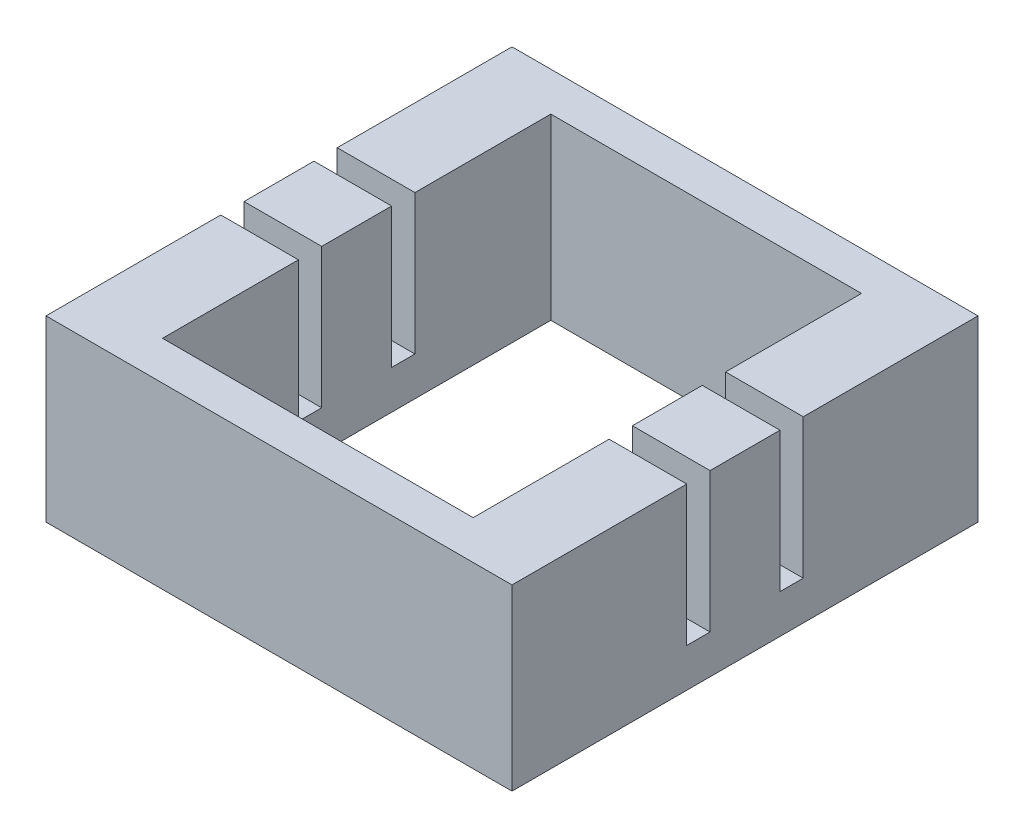
ISO-10303-21;
HEADER;
FILE_DESCRIPTION(('STEP AP214'),'2;1');
FILE_NAME('part.step','',(''),(''),'','','');
FILE_SCHEMA(('AUTOMOTIVE_DESIGN { 1 0 10303 214 1 1 1 1 }'));
ENDSEC;
DATA;
#1=APPLICATION_CONTEXT('core data for automotive mechanical design processes');
#2=APPLICATION_PROTOCOL_DEFINITION('international standard','automotive_design',2000,#1);
#3=PRODUCT_CONTEXT('',#1,'mechanical');
#4=PRODUCT('Part','Part','',(#3));
#5=PRODUCT_RELATED_PRODUCT_CATEGORY('part','',(#4));
#6=PRODUCT_DEFINITION_FORMATION('','',#4);
#7=PRODUCT_DEFINITION_CONTEXT('part definition',#1,'design');
#8=PRODUCT_DEFINITION('design','',#6,#7);
#9=PRODUCT_DEFINITION_SHAPE('','',#8);
#10=(LENGTH_UNIT() NAMED_UNIT(*) SI_UNIT(.MILLI.,.METRE.));
#11=(NAMED_UNIT(*) PLANE_ANGLE_UNIT() SI_UNIT($,.RADIAN.));
#12=(NAMED_UNIT(*) SI_UNIT($,.STERADIAN.) SOLID_ANGLE_UNIT());
#13=UNCERTAINTY_MEASURE_WITH_UNIT(LENGTH_MEASURE(1.E-05),#10,'distance_accuracy_value','');
#14=(GEOMETRIC_REPRESENTATION_CONTEXT(3) GLOBAL_UNCERTAINTY_ASSIGNED_CONTEXT((#13)) GLOBAL_UNIT_ASSIGNED_CONTEXT((#10,
#11,#12)) REPRESENTATION_CONTEXT('',''));
#15=CARTESIAN_POINT('',(0.,0.,0.));
#16=DIRECTION('',(0.,0.,1.));
#17=DIRECTION('',(1.,0.,0.));
#18=AXIS2_PLACEMENT_3D('',#15,#16,#17);
#19=CARTESIAN_POINT('',(0.,23.,0.));
#20=DIRECTION('',(0.,-1.,0.));
#21=DIRECTION('',(0.,0.,-1.));
#22=AXIS2_PLACEMENT_3D('',#19,#20,#21);
#23=PLANE('',#22);
#24=DIRECTION('',(0.,0.,1.));
#25=VECTOR('',#24,1.);
#26=CARTESIAN_POINT('',(0.,23.,0.));
#27=LINE('',#26,#25);
#28=CARTESIAN_POINT('',(0.,23.,-60.));
#29=VERTEX_POINT('',#28);
#30=CARTESIAN_POINT('',(0.,23.,-37.5));
#31=VERTEX_POINT('',#30);
#32=EDGE_CURVE('E324',#29,#31,#27,.T.);
#33=ORIENTED_EDGE('',*,*,#32,.T.);
#34=DIRECTION('',(-1.,0.,0.));
#35=VECTOR('',#34,1.);
#36=CARTESIAN_POINT('',(60.,23.,-37.5));
#37=LINE('',#36,#35);
#38=CARTESIAN_POINT('',(10.,23.,-37.5));
#39=VERTEX_POINT('',#38);
#40=EDGE_CURVE('E241',#39,#31,#37,.T.);
#41=ORIENTED_EDGE('',*,*,#40,.F.);
#42=DIRECTION('',(0.,0.,1.));
#43=VECTOR('',#42,1.);
#44=CARTESIAN_POINT('',(10.,23.,-5.));
#45=LINE('',#44,#43);
#46=CARTESIAN_POINT('',(10.,23.,-55.));
#47=VERTEX_POINT('',#46);
#48=EDGE_CURVE('E288',#47,#39,#45,.T.);
#49=ORIENTED_EDGE('',*,*,#48,.F.);
#50=DIRECTION('',(-1.,0.,0.));
#51=VECTOR('',#50,1.);
#52=CARTESIAN_POINT('',(10.,23.,-55.));
#53=LINE('',#52,#51);
#54=CARTESIAN_POINT('',(50.,23.,-55.));
#55=VERTEX_POINT('',#54);
#56=EDGE_CURVE('E299',#55,#47,#53,.T.);
#57=ORIENTED_EDGE('',*,*,#56,.F.);
#58=DIRECTION('',(0.,0.,-1.));
#59=VECTOR('',#58,1.);
#60=CARTESIAN_POINT('',(50.,23.,-5.));
#61=LINE('',#60,#59);
#62=CARTESIAN_POINT('',(50.,23.,-37.5));
#63=VERTEX_POINT('',#62);
#64=EDGE_CURVE('E295',#63,#55,#61,.T.);
#65=ORIENTED_EDGE('',*,*,#64,.F.);
#66=CARTESIAN_POINT('',(60.,23.,-37.5));
#67=VERTEX_POINT('',#66);
#68=EDGE_CURVE('E238',#67,#63,#37,.T.);
#69=ORIENTED_EDGE('',*,*,#68,.F.);
#70=DIRECTION('',(0.,0.,-1.));
#71=VECTOR('',#70,1.);
#72=CARTESIAN_POINT('',(60.,23.,0.));
#73=LINE('',#72,#71);
#74=CARTESIAN_POINT('',(60.,23.,-60.));
#75=VERTEX_POINT('',#74);
#76=EDGE_CURVE('E226',#67,#75,#73,.T.);
#77=ORIENTED_EDGE('',*,*,#76,.T.);
#78=DIRECTION('',(-1.,0.,0.));
#79=VECTOR('',#78,1.);
#80=CARTESIAN_POINT('',(0.,23.,-60.));
#81=LINE('',#80,#79);
#82=EDGE_CURVE('E334',#75,#29,#81,.T.);
#83=ORIENTED_EDGE('',*,*,#82,.T.);
#84=EDGE_LOOP('',(#33,#41,#49,#57,#65,#69,#77,#83));
#85=FACE_BOUND('',#84,.T.);
#86=ADVANCED_FACE('F43',(#85),#23,.F.);
#87=CARTESIAN_POINT('',(60.,23.,-25.5));
#88=VERTEX_POINT('',#87);
#89=CARTESIAN_POINT('',(60.,23.,-34.5));
#90=VERTEX_POINT('',#89);
#91=EDGE_CURVE('E335',#88,#90,#73,.T.);
#92=ORIENTED_EDGE('',*,*,#91,.T.);
#93=DIRECTION('',(-1.,0.,0.));
#94=VECTOR('',#93,1.);
#95=CARTESIAN_POINT('',(60.,23.,-34.5));
#96=LINE('',#95,#94);
#97=CARTESIAN_POINT('',(50.,23.,-34.5));
#98=VERTEX_POINT('',#97);
#99=EDGE_CURVE('E242',#90,#98,#96,.T.);
#100=ORIENTED_EDGE('',*,*,#99,.T.);
#101=CARTESIAN_POINT('',(50.,23.,-25.5));
#102=VERTEX_POINT('',#101);
#103=EDGE_CURVE('E300',#102,#98,#61,.T.);
#104=ORIENTED_EDGE('',*,*,#103,.F.);
#105=DIRECTION('',(-1.,0.,0.));
#106=VECTOR('',#105,1.);
#107=CARTESIAN_POINT('',(60.,23.,-25.5));
#108=LINE('',#107,#106);
#109=EDGE_CURVE('E252',#88,#102,#108,.T.);
#110=ORIENTED_EDGE('',*,*,#109,.F.);
#111=EDGE_LOOP('',(#92,#100,#104,#110));
#112=FACE_BOUND('',#111,.T.);
#113=ADVANCED_FACE('F372',(#112),#23,.F.);
#114=CARTESIAN_POINT('',(60.,23.,0.));
#115=VERTEX_POINT('',#114);
#116=CARTESIAN_POINT('',(60.,23.,-22.5));
#117=VERTEX_POINT('',#116);
#118=EDGE_CURVE('E331',#115,#117,#73,.T.);
#119=ORIENTED_EDGE('',*,*,#118,.T.);
#120=DIRECTION('',(-1.,0.,0.));
#121=VECTOR('',#120,1.);
#122=CARTESIAN_POINT('',(60.,23.,-22.5));
#123=LINE('',#122,#121);
#124=CARTESIAN_POINT('',(50.,23.,-22.5));
#125=VERTEX_POINT('',#124);
#126=EDGE_CURVE('E247',#117,#125,#123,.T.);
#127=ORIENTED_EDGE('',*,*,#126,.T.);
#128=CARTESIAN_POINT('',(50.,23.,-5.));
#129=VERTEX_POINT('',#128);
#130=EDGE_CURVE('E296',#129,#125,#61,.T.);
#131=ORIENTED_EDGE('',*,*,#130,.F.);
#132=DIRECTION('',(1.,0.,0.));
#133=VECTOR('',#132,1.);
#134=CARTESIAN_POINT('',(10.,23.,-5.));
#135=LINE('',#134,#133);
#136=CARTESIAN_POINT('',(10.,23.,-5.));
#137=VERTEX_POINT('',#136);
#138=EDGE_CURVE('E291',#137,#129,#135,.T.);
#139=ORIENTED_EDGE('',*,*,#138,.F.);
#140=CARTESIAN_POINT('',(10.,23.,-22.5));
#141=VERTEX_POINT('',#140);
#142=EDGE_CURVE('E293',#141,#137,#45,.T.);
#143=ORIENTED_EDGE('',*,*,#142,.F.);
#144=CARTESIAN_POINT('',(0.,23.,-22.5));
#145=VERTEX_POINT('',#144);
#146=EDGE_CURVE('E251',#141,#145,#123,.T.);
#147=ORIENTED_EDGE('',*,*,#146,.T.);
#148=CARTESIAN_POINT('',(0.,23.,0.));
#149=VERTEX_POINT('',#148);
#150=EDGE_CURVE('E329',#145,#149,#27,.T.);
#151=ORIENTED_EDGE('',*,*,#150,.T.);
#152=DIRECTION('',(1.,0.,0.));
#153=VECTOR('',#152,1.);
#154=CARTESIAN_POINT('',(0.,23.,0.));
#155=LINE('',#154,#153);
#156=EDGE_CURVE('E327',#149,#115,#155,.T.);
#157=ORIENTED_EDGE('',*,*,#156,.T.);
#158=EDGE_LOOP('',(#119,#127,#131,#139,#143,#147,#151,#157));
#159=FACE_BOUND('',#158,.T.);
#160=ADVANCED_FACE('F401',(#159),#23,.F.);
#161=CARTESIAN_POINT('',(10.,23.,-34.5));
#162=VERTEX_POINT('',#161);
#163=CARTESIAN_POINT('',(10.,23.,-25.5));
#164=VERTEX_POINT('',#163);
#165=EDGE_CURVE('E292',#162,#164,#45,.T.);
#166=ORIENTED_EDGE('',*,*,#165,.F.);
#167=CARTESIAN_POINT('',(0.,23.,-34.5));
#168=VERTEX_POINT('',#167);
#169=EDGE_CURVE('E245',#162,#168,#96,.T.);
#170=ORIENTED_EDGE('',*,*,#169,.T.);
#171=CARTESIAN_POINT('',(0.,23.,-25.5));
#172=VERTEX_POINT('',#171);
#173=EDGE_CURVE('E328',#168,#172,#27,.T.);
#174=ORIENTED_EDGE('',*,*,#173,.T.);
#175=EDGE_CURVE('E254',#164,#172,#108,.T.);
#176=ORIENTED_EDGE('',*,*,#175,.F.);
#177=EDGE_LOOP('',(#166,#170,#174,#176));
#178=FACE_BOUND('',#177,.T.);
#179=ADVANCED_FACE('F436',(#178),#23,.F.);
#180=CARTESIAN_POINT('',(0.,0.,0.));
#181=DIRECTION('',(0.,-1.,0.));
#182=DIRECTION('',(0.,0.,-1.));
#183=AXIS2_PLACEMENT_3D('',#180,#181,#182);
#184=PLANE('',#183);
#185=DIRECTION('',(0.,0.,1.));
#186=VECTOR('',#185,1.);
#187=CARTESIAN_POINT('',(0.,0.,0.));
#188=LINE('',#187,#186);
#189=CARTESIAN_POINT('',(0.,0.,-60.));
#190=VERTEX_POINT('',#189);
#191=CARTESIAN_POINT('',(0.,0.,0.));
#192=VERTEX_POINT('',#191);
#193=EDGE_CURVE('E323',#190,#192,#188,.T.);
#194=ORIENTED_EDGE('',*,*,#193,.F.);
#195=DIRECTION('',(-1.,0.,0.));
#196=VECTOR('',#195,1.);
#197=CARTESIAN_POINT('',(0.,0.,-60.));
#198=LINE('',#197,#196);
#199=CARTESIAN_POINT('',(60.,0.,-60.));
#200=VERTEX_POINT('',#199);
#201=EDGE_CURVE('E344',#200,#190,#198,.T.);
#202=ORIENTED_EDGE('',*,*,#201,.F.);
#203=DIRECTION('',(0.,0.,-1.));
#204=VECTOR('',#203,1.);
#205=CARTESIAN_POINT('',(60.,0.,0.));
#206=LINE('',#205,#204);
#207=CARTESIAN_POINT('',(60.,0.,0.));
#208=VERTEX_POINT('',#207);
#209=EDGE_CURVE('E342',#208,#200,#206,.T.);
#210=ORIENTED_EDGE('',*,*,#209,.F.);
#211=DIRECTION('',(1.,0.,0.));
#212=VECTOR('',#211,1.);
#213=CARTESIAN_POINT('',(0.,0.,0.));
#214=LINE('',#213,#212);
#215=EDGE_CURVE('E340',#192,#208,#214,.T.);
#216=ORIENTED_EDGE('',*,*,#215,.F.);
#217=EDGE_LOOP('',(#194,#202,#210,#216));
#218=FACE_BOUND('',#217,.T.);
#219=DIRECTION('',(-1.,0.,0.));
#220=VECTOR('',#219,1.);
#221=CARTESIAN_POINT('',(10.,0.,-55.));
#222=LINE('',#221,#220);
#223=CARTESIAN_POINT('',(50.,0.,-55.));
#224=VERTEX_POINT('',#223);
#225=CARTESIAN_POINT('',(10.,0.,-55.));
#226=VERTEX_POINT('',#225);
#227=EDGE_CURVE('E311',#224,#226,#222,.T.);
#228=ORIENTED_EDGE('',*,*,#227,.T.);
#229=DIRECTION('',(0.,0.,1.));
#230=VECTOR('',#229,1.);
#231=CARTESIAN_POINT('',(10.,0.,-5.));
#232=LINE('',#231,#230);
#233=CARTESIAN_POINT('',(10.,0.,-5.));
#234=VERTEX_POINT('',#233);
#235=EDGE_CURVE('E287',#226,#234,#232,.T.);
#236=ORIENTED_EDGE('',*,*,#235,.T.);
#237=DIRECTION('',(1.,0.,0.));
#238=VECTOR('',#237,1.);
#239=CARTESIAN_POINT('',(10.,0.,-5.));
#240=LINE('',#239,#238);
#241=CARTESIAN_POINT('',(50.,0.,-5.));
#242=VERTEX_POINT('',#241);
#243=EDGE_CURVE('E305',#234,#242,#240,.T.);
#244=ORIENTED_EDGE('',*,*,#243,.T.);
#245=DIRECTION('',(0.,0.,-1.));
#246=VECTOR('',#245,1.);
#247=CARTESIAN_POINT('',(50.,0.,-5.));
#248=LINE('',#247,#246);
#249=EDGE_CURVE('E308',#242,#224,#248,.T.);
#250=ORIENTED_EDGE('',*,*,#249,.T.);
#251=EDGE_LOOP('',(#228,#236,#244,#250));
#252=FACE_BOUND('',#251,.T.);
#253=ADVANCED_FACE('F394',(#218,#252),#184,.T.);
#254=CARTESIAN_POINT('',(0.,23.,0.));
#255=DIRECTION('',(1.,0.,0.));
#256=DIRECTION('',(0.,0.,-1.));
#257=AXIS2_PLACEMENT_3D('',#254,#255,#256);
#258=PLANE('',#257);
#259=DIRECTION('',(0.,0.,1.));
#260=VECTOR('',#259,1.);
#261=CARTESIAN_POINT('',(0.,5.,-37.5));
#262=LINE('',#261,#260);
#263=CARTESIAN_POINT('',(0.,5.,-37.5));
#264=VERTEX_POINT('',#263);
#265=CARTESIAN_POINT('',(0.,5.,-34.5));
#266=VERTEX_POINT('',#265);
#267=EDGE_CURVE('E229',#264,#266,#262,.T.);
#268=ORIENTED_EDGE('',*,*,#267,.F.);
#269=DIRECTION('',(0.,-1.,0.));
#270=VECTOR('',#269,1.);
#271=CARTESIAN_POINT('',(0.,23.,-37.5));
#272=LINE('',#271,#270);
#273=EDGE_CURVE('E233',#31,#264,#272,.T.);
#274=ORIENTED_EDGE('',*,*,#273,.F.);
#275=ORIENTED_EDGE('',*,*,#32,.F.);
#276=DIRECTION('',(0.,-1.,0.));
#277=VECTOR('',#276,1.);
#278=CARTESIAN_POINT('',(0.,23.,-60.));
#279=LINE('',#278,#277);
#280=EDGE_CURVE('E337',#29,#190,#279,.T.);
#281=ORIENTED_EDGE('',*,*,#280,.T.);
#282=ORIENTED_EDGE('',*,*,#193,.T.);
#283=DIRECTION('',(0.,-1.,0.));
#284=VECTOR('',#283,1.);
#285=CARTESIAN_POINT('',(0.,23.,0.));
#286=LINE('',#285,#284);
#287=EDGE_CURVE('E354',#149,#192,#286,.T.);
#288=ORIENTED_EDGE('',*,*,#287,.F.);
#289=ORIENTED_EDGE('',*,*,#150,.F.);
#290=DIRECTION('',(0.,1.,0.));
#291=VECTOR('',#290,1.);
#292=CARTESIAN_POINT('',(0.,23.,-22.5));
#293=LINE('',#292,#291);
#294=CARTESIAN_POINT('',(0.,5.,-22.5));
#295=VERTEX_POINT('',#294);
#296=EDGE_CURVE('E236',#295,#145,#293,.T.);
#297=ORIENTED_EDGE('',*,*,#296,.F.);
#298=DIRECTION('',(0.,0.,1.));
#299=VECTOR('',#298,1.);
#300=CARTESIAN_POINT('',(0.,5.,-22.5));
#301=LINE('',#300,#299);
#302=CARTESIAN_POINT('',(0.,5.,-25.5));
#303=VERTEX_POINT('',#302);
#304=EDGE_CURVE('E262',#303,#295,#301,.T.);
#305=ORIENTED_EDGE('',*,*,#304,.F.);
#306=DIRECTION('',(0.,-1.,0.));
#307=VECTOR('',#306,1.);
#308=CARTESIAN_POINT('',(0.,23.,-25.5));
#309=LINE('',#308,#307);
#310=EDGE_CURVE('E265',#172,#303,#309,.T.);
#311=ORIENTED_EDGE('',*,*,#310,.F.);
#312=ORIENTED_EDGE('',*,*,#173,.F.);
#313=DIRECTION('',(0.,1.,0.));
#314=VECTOR('',#313,1.);
#315=CARTESIAN_POINT('',(0.,23.,-34.5));
#316=LINE('',#315,#314);
#317=EDGE_CURVE('E227',#266,#168,#316,.T.);
#318=ORIENTED_EDGE('',*,*,#317,.F.);
#319=EDGE_LOOP('',(#268,#274,#275,#281,#282,#288,#289,#297,#305,#311,#312,#318));
#320=FACE_BOUND('',#319,.T.);
#321=ADVANCED_FACE('F45',(#320),#258,.F.);
#322=CARTESIAN_POINT('',(0.,23.,0.));
#323=DIRECTION('',(0.,0.,-1.));
#324=DIRECTION('',(-1.,0.,0.));
#325=AXIS2_PLACEMENT_3D('',#322,#323,#324);
#326=PLANE('',#325);
#327=ORIENTED_EDGE('',*,*,#215,.T.);
#328=DIRECTION('',(0.,-1.,0.));
#329=VECTOR('',#328,1.);
#330=CARTESIAN_POINT('',(60.,23.,0.));
#331=LINE('',#330,#329);
#332=EDGE_CURVE('E351',#115,#208,#331,.T.);
#333=ORIENTED_EDGE('',*,*,#332,.F.);
#334=ORIENTED_EDGE('',*,*,#156,.F.);
#335=ORIENTED_EDGE('',*,*,#287,.T.);
#336=EDGE_LOOP('',(#327,#333,#334,#335));
#337=FACE_BOUND('',#336,.T.);
#338=ADVANCED_FACE('F593',(#337),#326,.F.);
#339=CARTESIAN_POINT('',(60.,23.,0.));
#340=DIRECTION('',(-1.,0.,0.));
#341=DIRECTION('',(0.,0.,1.));
#342=AXIS2_PLACEMENT_3D('',#339,#340,#341);
#343=PLANE('',#342);
#344=ORIENTED_EDGE('',*,*,#76,.F.);
#345=DIRECTION('',(0.,-1.,0.));
#346=VECTOR('',#345,1.);
#347=CARTESIAN_POINT('',(60.,23.,-37.5));
#348=LINE('',#347,#346);
#349=CARTESIAN_POINT('',(60.,5.,-37.5));
#350=VERTEX_POINT('',#349);
#351=EDGE_CURVE('E206',#67,#350,#348,.T.);
#352=ORIENTED_EDGE('',*,*,#351,.T.);
#353=DIRECTION('',(0.,0.,1.));
#354=VECTOR('',#353,1.);
#355=CARTESIAN_POINT('',(60.,5.,-37.5));
#356=LINE('',#355,#354);
#357=CARTESIAN_POINT('',(60.,5.,-34.5));
#358=VERTEX_POINT('',#357);
#359=EDGE_CURVE('E214',#350,#358,#356,.T.);
#360=ORIENTED_EDGE('',*,*,#359,.T.);
#361=DIRECTION('',(0.,1.,0.));
#362=VECTOR('',#361,1.);
#363=CARTESIAN_POINT('',(60.,23.,-34.5));
#364=LINE('',#363,#362);
#365=EDGE_CURVE('E221',#358,#90,#364,.T.);
#366=ORIENTED_EDGE('',*,*,#365,.T.);
#367=ORIENTED_EDGE('',*,*,#91,.F.);
#368=DIRECTION('',(0.,-1.,0.));
#369=VECTOR('',#368,1.);
#370=CARTESIAN_POINT('',(60.,23.,-25.5));
#371=LINE('',#370,#369);
#372=CARTESIAN_POINT('',(60.,5.,-25.5));
#373=VERTEX_POINT('',#372);
#374=EDGE_CURVE('E271',#88,#373,#371,.T.);
#375=ORIENTED_EDGE('',*,*,#374,.T.);
#376=DIRECTION('',(0.,0.,1.));
#377=VECTOR('',#376,1.);
#378=CARTESIAN_POINT('',(60.,5.,-22.5));
#379=LINE('',#378,#377);
#380=CARTESIAN_POINT('',(60.,5.,-22.5));
#381=VERTEX_POINT('',#380);
#382=EDGE_CURVE('E250',#373,#381,#379,.T.);
#383=ORIENTED_EDGE('',*,*,#382,.T.);
#384=DIRECTION('',(0.,1.,0.));
#385=VECTOR('',#384,1.);
#386=CARTESIAN_POINT('',(60.,23.,-22.5));
#387=LINE('',#386,#385);
#388=EDGE_CURVE('E266',#381,#117,#387,.T.);
#389=ORIENTED_EDGE('',*,*,#388,.T.);
#390=ORIENTED_EDGE('',*,*,#118,.F.);
#391=ORIENTED_EDGE('',*,*,#332,.T.);
#392=ORIENTED_EDGE('',*,*,#209,.T.);
#393=DIRECTION('',(0.,-1.,0.));
#394=VECTOR('',#393,1.);
#395=CARTESIAN_POINT('',(60.,23.,-60.));
#396=LINE('',#395,#394);
#397=EDGE_CURVE('E348',#75,#200,#396,.T.);
#398=ORIENTED_EDGE('',*,*,#397,.F.);
#399=EDGE_LOOP('',(#344,#352,#360,#366,#367,#375,#383,#389,#390,#391,#392,#398));
#400=FACE_BOUND('',#399,.T.);
#401=ADVANCED_FACE('F224',(#400),#343,.F.);
#402=CARTESIAN_POINT('',(0.,23.,-60.));
#403=DIRECTION('',(0.,0.,1.));
#404=DIRECTION('',(1.,0.,0.));
#405=AXIS2_PLACEMENT_3D('',#402,#403,#404);
#406=PLANE('',#405);
#407=ORIENTED_EDGE('',*,*,#201,.T.);
#408=ORIENTED_EDGE('',*,*,#280,.F.);
#409=ORIENTED_EDGE('',*,*,#82,.F.);
#410=ORIENTED_EDGE('',*,*,#397,.T.);
#411=EDGE_LOOP('',(#407,#408,#409,#410));
#412=FACE_BOUND('',#411,.T.);
#413=ADVANCED_FACE('F417',(#412),#406,.F.);
#414=CARTESIAN_POINT('',(10.,23.,-5.));
#415=DIRECTION('',(1.,0.,0.));
#416=DIRECTION('',(0.,0.,-1.));
#417=AXIS2_PLACEMENT_3D('',#414,#415,#416);
#418=PLANE('',#417);
#419=DIRECTION('',(0.,1.,0.));
#420=VECTOR('',#419,1.);
#421=CARTESIAN_POINT('',(10.,23.,-37.5));
#422=LINE('',#421,#420);
#423=CARTESIAN_POINT('',(10.,5.,-37.5));
#424=VERTEX_POINT('',#423);
#425=EDGE_CURVE('E285',#424,#39,#422,.T.);
#426=ORIENTED_EDGE('',*,*,#425,.F.);
#427=DIRECTION('',(0.,0.,-1.));
#428=VECTOR('',#427,1.);
#429=CARTESIAN_POINT('',(10.,5.,-5.));
#430=LINE('',#429,#428);
#431=CARTESIAN_POINT('',(10.,5.,-34.5));
#432=VERTEX_POINT('',#431);
#433=EDGE_CURVE('E281',#432,#424,#430,.T.);
#434=ORIENTED_EDGE('',*,*,#433,.F.);
#435=DIRECTION('',(0.,-1.,0.));
#436=VECTOR('',#435,1.);
#437=CARTESIAN_POINT('',(10.,23.,-34.5));
#438=LINE('',#437,#436);
#439=EDGE_CURVE('E283',#162,#432,#438,.T.);
#440=ORIENTED_EDGE('',*,*,#439,.F.);
#441=ORIENTED_EDGE('',*,*,#165,.T.);
#442=DIRECTION('',(0.,1.,0.));
#443=VECTOR('',#442,1.);
#444=CARTESIAN_POINT('',(10.,23.,-25.5));
#445=LINE('',#444,#443);
#446=CARTESIAN_POINT('',(10.,5.,-25.5));
#447=VERTEX_POINT('',#446);
#448=EDGE_CURVE('E240',#447,#164,#445,.T.);
#449=ORIENTED_EDGE('',*,*,#448,.F.);
#450=DIRECTION('',(0.,0.,-1.));
#451=VECTOR('',#450,1.);
#452=CARTESIAN_POINT('',(10.,5.,-5.));
#453=LINE('',#452,#451);
#454=CARTESIAN_POINT('',(10.,5.,-22.5));
#455=VERTEX_POINT('',#454);
#456=EDGE_CURVE('E277',#455,#447,#453,.T.);
#457=ORIENTED_EDGE('',*,*,#456,.F.);
#458=DIRECTION('',(0.,-1.,0.));
#459=VECTOR('',#458,1.);
#460=CARTESIAN_POINT('',(10.,23.,-22.5));
#461=LINE('',#460,#459);
#462=EDGE_CURVE('E279',#141,#455,#461,.T.);
#463=ORIENTED_EDGE('',*,*,#462,.F.);
#464=ORIENTED_EDGE('',*,*,#142,.T.);
#465=DIRECTION('',(0.,-1.,0.));
#466=VECTOR('',#465,1.);
#467=CARTESIAN_POINT('',(10.,23.,-5.));
#468=LINE('',#467,#466);
#469=EDGE_CURVE('E320',#137,#234,#468,.T.);
#470=ORIENTED_EDGE('',*,*,#469,.T.);
#471=ORIENTED_EDGE('',*,*,#235,.F.);
#472=DIRECTION('',(0.,-1.,0.));
#473=VECTOR('',#472,1.);
#474=CARTESIAN_POINT('',(10.,23.,-55.));
#475=LINE('',#474,#473);
#476=EDGE_CURVE('E302',#47,#226,#475,.T.);
#477=ORIENTED_EDGE('',*,*,#476,.F.);
#478=ORIENTED_EDGE('',*,*,#48,.T.);
#479=EDGE_LOOP('',(#426,#434,#440,#441,#449,#457,#463,#464,#470,#471,#477,#478));
#480=FACE_BOUND('',#479,.T.);
#481=ADVANCED_FACE('F391',(#480),#418,.T.);
#482=CARTESIAN_POINT('',(10.,23.,-5.));
#483=DIRECTION('',(0.,0.,-1.));
#484=DIRECTION('',(-1.,0.,0.));
#485=AXIS2_PLACEMENT_3D('',#482,#483,#484);
#486=PLANE('',#485);
#487=ORIENTED_EDGE('',*,*,#243,.F.);
#488=ORIENTED_EDGE('',*,*,#469,.F.);
#489=ORIENTED_EDGE('',*,*,#138,.T.);
#490=DIRECTION('',(0.,-1.,0.));
#491=VECTOR('',#490,1.);
#492=CARTESIAN_POINT('',(50.,23.,-5.));
#493=LINE('',#492,#491);
#494=EDGE_CURVE('E318',#129,#242,#493,.T.);
#495=ORIENTED_EDGE('',*,*,#494,.T.);
#496=EDGE_LOOP('',(#487,#488,#489,#495));
#497=FACE_BOUND('',#496,.T.);
#498=ADVANCED_FACE('F443',(#497),#486,.T.);
#499=CARTESIAN_POINT('',(50.,23.,-5.));
#500=DIRECTION('',(-1.,0.,0.));
#501=DIRECTION('',(0.,0.,1.));
#502=AXIS2_PLACEMENT_3D('',#499,#500,#501);
#503=PLANE('',#502);
#504=DIRECTION('',(0.,-1.,0.));
#505=VECTOR('',#504,1.);
#506=CARTESIAN_POINT('',(50.,23.,-37.5));
#507=LINE('',#506,#505);
#508=CARTESIAN_POINT('',(50.,5.,-37.5));
#509=VERTEX_POINT('',#508);
#510=EDGE_CURVE('E11',#63,#509,#507,.T.);
#511=ORIENTED_EDGE('',*,*,#510,.F.);
#512=ORIENTED_EDGE('',*,*,#64,.T.);
#513=DIRECTION('',(0.,-1.,0.));
#514=VECTOR('',#513,1.);
#515=CARTESIAN_POINT('',(50.,23.,-55.));
#516=LINE('',#515,#514);
#517=EDGE_CURVE('E316',#55,#224,#516,.T.);
#518=ORIENTED_EDGE('',*,*,#517,.T.);
#519=ORIENTED_EDGE('',*,*,#249,.F.);
#520=ORIENTED_EDGE('',*,*,#494,.F.);
#521=ORIENTED_EDGE('',*,*,#130,.T.);
#522=DIRECTION('',(0.,1.,0.));
#523=VECTOR('',#522,1.);
#524=CARTESIAN_POINT('',(50.,23.,-22.5));
#525=LINE('',#524,#523);
#526=CARTESIAN_POINT('',(50.,5.,-22.5));
#527=VERTEX_POINT('',#526);
#528=EDGE_CURVE('E361',#527,#125,#525,.T.);
#529=ORIENTED_EDGE('',*,*,#528,.F.);
#530=DIRECTION('',(0.,0.,1.));
#531=VECTOR('',#530,1.);
#532=CARTESIAN_POINT('',(50.,5.,-5.));
#533=LINE('',#532,#531);
#534=CARTESIAN_POINT('',(50.,5.,-25.5));
#535=VERTEX_POINT('',#534);
#536=EDGE_CURVE('E359',#535,#527,#533,.T.);
#537=ORIENTED_EDGE('',*,*,#536,.F.);
#538=DIRECTION('',(0.,-1.,0.));
#539=VECTOR('',#538,1.);
#540=CARTESIAN_POINT('',(50.,23.,-25.5));
#541=LINE('',#540,#539);
#542=EDGE_CURVE('E357',#102,#535,#541,.T.);
#543=ORIENTED_EDGE('',*,*,#542,.F.);
#544=ORIENTED_EDGE('',*,*,#103,.T.);
#545=DIRECTION('',(0.,1.,0.));
#546=VECTOR('',#545,1.);
#547=CARTESIAN_POINT('',(50.,23.,-34.5));
#548=LINE('',#547,#546);
#549=CARTESIAN_POINT('',(50.,5.,-34.5));
#550=VERTEX_POINT('',#549);
#551=EDGE_CURVE('E51',#550,#98,#548,.T.);
#552=ORIENTED_EDGE('',*,*,#551,.F.);
#553=DIRECTION('',(0.,0.,1.));
#554=VECTOR('',#553,1.);
#555=CARTESIAN_POINT('',(50.,5.,-5.));
#556=LINE('',#555,#554);
#557=EDGE_CURVE('E363',#509,#550,#556,.T.);
#558=ORIENTED_EDGE('',*,*,#557,.F.);
#559=EDGE_LOOP('',(#511,#512,#518,#519,#520,#521,#529,#537,#543,#544,#552,#558));
#560=FACE_BOUND('',#559,.T.);
#561=ADVANCED_FACE('F376',(#560),#503,.T.);
#562=CARTESIAN_POINT('',(10.,23.,-55.));
#563=DIRECTION('',(0.,0.,1.));
#564=DIRECTION('',(1.,0.,0.));
#565=AXIS2_PLACEMENT_3D('',#562,#563,#564);
#566=PLANE('',#565);
#567=ORIENTED_EDGE('',*,*,#227,.F.);
#568=ORIENTED_EDGE('',*,*,#517,.F.);
#569=ORIENTED_EDGE('',*,*,#56,.T.);
#570=ORIENTED_EDGE('',*,*,#476,.T.);
#571=EDGE_LOOP('',(#567,#568,#569,#570));
#572=FACE_BOUND('',#571,.T.);
#573=ADVANCED_FACE('F385',(#572),#566,.T.);
#574=CARTESIAN_POINT('',(60.,23.,-25.5));
#575=DIRECTION('',(0.,0.,-1.));
#576=DIRECTION('',(0.,1.,0.));
#577=AXIS2_PLACEMENT_3D('',#574,#575,#576);
#578=PLANE('',#577);
#579=ORIENTED_EDGE('',*,*,#542,.T.);
#580=DIRECTION('',(-1.,0.,0.));
#581=VECTOR('',#580,1.);
#582=CARTESIAN_POINT('',(60.,5.,-25.5));
#583=LINE('',#582,#581);
#584=EDGE_CURVE('E255',#373,#535,#583,.T.);
#585=ORIENTED_EDGE('',*,*,#584,.F.);
#586=ORIENTED_EDGE('',*,*,#374,.F.);
#587=ORIENTED_EDGE('',*,*,#109,.T.);
#588=EDGE_LOOP('',(#579,#585,#586,#587));
#589=FACE_BOUND('',#588,.T.);
#590=ADVANCED_FACE('F411',(#589),#578,.F.);
#591=CARTESIAN_POINT('',(60.,5.,-22.5));
#592=DIRECTION('',(0.,-1.,0.));
#593=DIRECTION('',(0.,0.,-1.));
#594=AXIS2_PLACEMENT_3D('',#591,#592,#593);
#595=PLANE('',#594);
#596=ORIENTED_EDGE('',*,*,#536,.T.);
#597=DIRECTION('',(-1.,0.,0.));
#598=VECTOR('',#597,1.);
#599=CARTESIAN_POINT('',(60.,5.,-22.5));
#600=LINE('',#599,#598);
#601=EDGE_CURVE('E258',#381,#527,#600,.T.);
#602=ORIENTED_EDGE('',*,*,#601,.F.);
#603=ORIENTED_EDGE('',*,*,#382,.F.);
#604=ORIENTED_EDGE('',*,*,#584,.T.);
#605=EDGE_LOOP('',(#596,#602,#603,#604));
#606=FACE_BOUND('',#605,.T.);
#607=ADVANCED_FACE('F409',(#606),#595,.F.);
#608=CARTESIAN_POINT('',(60.,23.,-22.5));
#609=DIRECTION('',(0.,0.,1.));
#610=DIRECTION('',(0.,-1.,0.));
#611=AXIS2_PLACEMENT_3D('',#608,#609,#610);
#612=PLANE('',#611);
#613=ORIENTED_EDGE('',*,*,#528,.T.);
#614=ORIENTED_EDGE('',*,*,#126,.F.);
#615=ORIENTED_EDGE('',*,*,#388,.F.);
#616=ORIENTED_EDGE('',*,*,#601,.T.);
#617=EDGE_LOOP('',(#613,#614,#615,#616));
#618=FACE_BOUND('',#617,.T.);
#619=ADVANCED_FACE('F406',(#618),#612,.F.);
#620=CARTESIAN_POINT('',(60.,5.,-37.5));
#621=DIRECTION('',(0.,-1.,0.));
#622=DIRECTION('',(0.,0.,-1.));
#623=AXIS2_PLACEMENT_3D('',#620,#621,#622);
#624=PLANE('',#623);
#625=ORIENTED_EDGE('',*,*,#557,.T.);
#626=DIRECTION('',(-1.,0.,0.));
#627=VECTOR('',#626,1.);
#628=CARTESIAN_POINT('',(60.,5.,-34.5));
#629=LINE('',#628,#627);
#630=EDGE_CURVE('E217',#358,#550,#629,.T.);
#631=ORIENTED_EDGE('',*,*,#630,.F.);
#632=ORIENTED_EDGE('',*,*,#359,.F.);
#633=DIRECTION('',(-1.,0.,0.));
#634=VECTOR('',#633,1.);
#635=CARTESIAN_POINT('',(60.,5.,-37.5));
#636=LINE('',#635,#634);
#637=EDGE_CURVE('E202',#350,#509,#636,.T.);
#638=ORIENTED_EDGE('',*,*,#637,.T.);
#639=EDGE_LOOP('',(#625,#631,#632,#638));
#640=FACE_BOUND('',#639,.T.);
#641=ADVANCED_FACE('F215',(#640),#624,.F.);
#642=CARTESIAN_POINT('',(60.,23.,-34.5));
#643=DIRECTION('',(0.,0.,1.));
#644=DIRECTION('',(1.,0.,0.));
#645=AXIS2_PLACEMENT_3D('',#642,#643,#644);
#646=PLANE('',#645);
#647=ORIENTED_EDGE('',*,*,#551,.T.);
#648=ORIENTED_EDGE('',*,*,#99,.F.);
#649=ORIENTED_EDGE('',*,*,#365,.F.);
#650=ORIENTED_EDGE('',*,*,#630,.T.);
#651=EDGE_LOOP('',(#647,#648,#649,#650));
#652=FACE_BOUND('',#651,.T.);
#653=ADVANCED_FACE('F366',(#652),#646,.F.);
#654=CARTESIAN_POINT('',(60.,23.,-37.5));
#655=DIRECTION('',(0.,0.,-1.));
#656=DIRECTION('',(-1.,0.,0.));
#657=AXIS2_PLACEMENT_3D('',#654,#655,#656);
#658=PLANE('',#657);
#659=ORIENTED_EDGE('',*,*,#510,.T.);
#660=ORIENTED_EDGE('',*,*,#637,.F.);
#661=ORIENTED_EDGE('',*,*,#351,.F.);
#662=ORIENTED_EDGE('',*,*,#68,.T.);
#663=EDGE_LOOP('',(#659,#660,#661,#662));
#664=FACE_BOUND('',#663,.T.);
#665=ADVANCED_FACE('F204',(#664),#658,.F.);
#666=ORIENTED_EDGE('',*,*,#462,.T.);
#667=EDGE_CURVE('E261',#455,#295,#600,.T.);
#668=ORIENTED_EDGE('',*,*,#667,.T.);
#669=ORIENTED_EDGE('',*,*,#296,.T.);
#670=ORIENTED_EDGE('',*,*,#146,.F.);
#671=EDGE_LOOP('',(#666,#668,#669,#670));
#672=FACE_BOUND('',#671,.T.);
#673=ADVANCED_FACE('F504',(#672),#612,.F.);
#674=ORIENTED_EDGE('',*,*,#456,.T.);
#675=EDGE_CURVE('E66',#447,#303,#583,.T.);
#676=ORIENTED_EDGE('',*,*,#675,.T.);
#677=ORIENTED_EDGE('',*,*,#304,.T.);
#678=ORIENTED_EDGE('',*,*,#667,.F.);
#679=EDGE_LOOP('',(#674,#676,#677,#678));
#680=FACE_BOUND('',#679,.T.);
#681=ADVANCED_FACE('F496',(#680),#595,.F.);
#682=ORIENTED_EDGE('',*,*,#448,.T.);
#683=ORIENTED_EDGE('',*,*,#175,.T.);
#684=ORIENTED_EDGE('',*,*,#310,.T.);
#685=ORIENTED_EDGE('',*,*,#675,.F.);
#686=EDGE_LOOP('',(#682,#683,#684,#685));
#687=FACE_BOUND('',#686,.T.);
#688=ADVANCED_FACE('F488',(#687),#578,.F.);
#689=ORIENTED_EDGE('',*,*,#425,.T.);
#690=ORIENTED_EDGE('',*,*,#40,.T.);
#691=ORIENTED_EDGE('',*,*,#273,.T.);
#692=EDGE_CURVE('E211',#424,#264,#636,.T.);
#693=ORIENTED_EDGE('',*,*,#692,.F.);
#694=EDGE_LOOP('',(#689,#690,#691,#693));
#695=FACE_BOUND('',#694,.T.);
#696=ADVANCED_FACE('F426',(#695),#658,.F.);
#697=ORIENTED_EDGE('',*,*,#439,.T.);
#698=EDGE_CURVE('E58',#432,#266,#629,.T.);
#699=ORIENTED_EDGE('',*,*,#698,.T.);
#700=ORIENTED_EDGE('',*,*,#317,.T.);
#701=ORIENTED_EDGE('',*,*,#169,.F.);
#702=EDGE_LOOP('',(#697,#699,#700,#701));
#703=FACE_BOUND('',#702,.T.);
#704=ADVANCED_FACE('F519',(#703),#646,.F.);
#705=ORIENTED_EDGE('',*,*,#433,.T.);
#706=ORIENTED_EDGE('',*,*,#692,.T.);
#707=ORIENTED_EDGE('',*,*,#267,.T.);
#708=ORIENTED_EDGE('',*,*,#698,.F.);
#709=EDGE_LOOP('',(#705,#706,#707,#708));
#710=FACE_BOUND('',#709,.T.);
#711=ADVANCED_FACE('F427',(#710),#624,.F.);
#712=CLOSED_SHELL('',(#86,#113,#160,#179,#253,#321,#338,#401,#413,#481,#498,#561,#573,#590,#607,
#619,#641,#653,#665,#673,#681,#688,#696,#704,#711));
#713=MANIFOLD_SOLID_BREP('B2',#712);
#714=ADVANCED_BREP_SHAPE_REPRESENTATION('',(#18,#713),#14);
#715=SHAPE_DEFINITION_REPRESENTATION(#9,#714);
ENDSEC;
END-ISO-10303-21;
